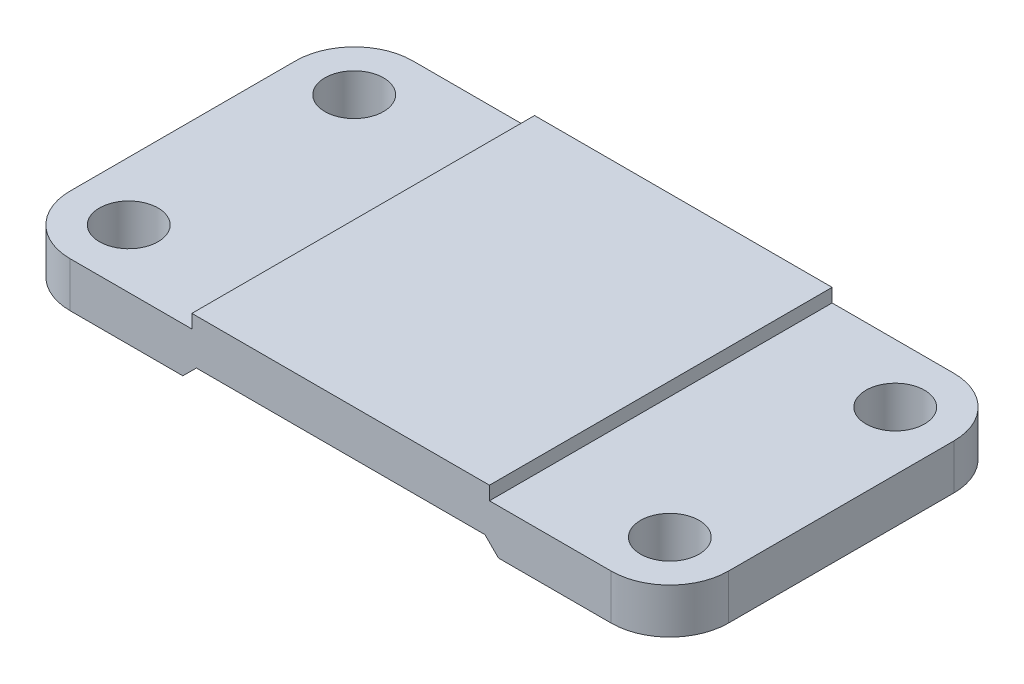
ISO-10303-21;
HEADER;
FILE_DESCRIPTION(('STEP AP214'),'2;1');
FILE_NAME('part.step','',(''),(''),'','','');
FILE_SCHEMA(('AUTOMOTIVE_DESIGN { 1 0 10303 214 1 1 1 1 }'));
ENDSEC;
DATA;
#1=APPLICATION_CONTEXT('core data for automotive mechanical design processes');
#2=APPLICATION_PROTOCOL_DEFINITION('international standard','automotive_design',2000,#1);
#3=PRODUCT_CONTEXT('',#1,'mechanical');
#4=PRODUCT('Part','Part','',(#3));
#5=PRODUCT_RELATED_PRODUCT_CATEGORY('part','',(#4));
#6=PRODUCT_DEFINITION_FORMATION('','',#4);
#7=PRODUCT_DEFINITION_CONTEXT('part definition',#1,'design');
#8=PRODUCT_DEFINITION('design','',#6,#7);
#9=PRODUCT_DEFINITION_SHAPE('','',#8);
#10=(LENGTH_UNIT() NAMED_UNIT(*) SI_UNIT(.MILLI.,.METRE.));
#11=(NAMED_UNIT(*) PLANE_ANGLE_UNIT() SI_UNIT($,.RADIAN.));
#12=(NAMED_UNIT(*) SI_UNIT($,.STERADIAN.) SOLID_ANGLE_UNIT());
#13=UNCERTAINTY_MEASURE_WITH_UNIT(LENGTH_MEASURE(1.E-05),#10,'distance_accuracy_value','');
#14=(GEOMETRIC_REPRESENTATION_CONTEXT(3) GLOBAL_UNCERTAINTY_ASSIGNED_CONTEXT((#13)) GLOBAL_UNIT_ASSIGNED_CONTEXT((#10,
#11,#12)) REPRESENTATION_CONTEXT('',''));
#15=CARTESIAN_POINT('',(0.,0.,0.));
#16=DIRECTION('',(0.,0.,1.));
#17=DIRECTION('',(1.,0.,0.));
#18=AXIS2_PLACEMENT_3D('',#15,#16,#17);
#19=CARTESIAN_POINT('',(0.,0.,0.));
#20=DIRECTION('',(0.,-1.,0.));
#21=DIRECTION('',(0.,0.,-1.));
#22=AXIS2_PLACEMENT_3D('',#19,#20,#21);
#23=PLANE('',#22);
#24=DIRECTION('',(1.,0.,0.));
#25=VECTOR('',#24,1.);
#26=CARTESIAN_POINT('',(-73.,0.,38.));
#27=LINE('',#26,#25);
#28=CARTESIAN_POINT('',(35.,0.,38.));
#29=VERTEX_POINT('',#28);
#30=CARTESIAN_POINT('',(60.,0.,38.));
#31=VERTEX_POINT('',#30);
#32=EDGE_CURVE('E214',#29,#31,#27,.T.);
#33=ORIENTED_EDGE('',*,*,#32,.F.);
#34=DIRECTION('',(0.,0.,1.));
#35=VECTOR('',#34,1.);
#36=CARTESIAN_POINT('',(35.,0.,0.));
#37=LINE('',#36,#35);
#38=CARTESIAN_POINT('',(35.,0.,-38.));
#39=VERTEX_POINT('',#38);
#40=EDGE_CURVE('E62',#29,#39,#37,.F.);
#41=ORIENTED_EDGE('',*,*,#40,.T.);
#42=DIRECTION('',(-1.,0.,0.));
#43=VECTOR('',#42,1.);
#44=CARTESIAN_POINT('',(-73.,0.,-38.));
#45=LINE('',#44,#43);
#46=CARTESIAN_POINT('',(60.,0.,-38.));
#47=VERTEX_POINT('',#46);
#48=EDGE_CURVE('E67',#47,#39,#45,.T.);
#49=ORIENTED_EDGE('',*,*,#48,.F.);
#50=CARTESIAN_POINT('',(60.,0.,-25.));
#51=DIRECTION('',(0.,-1.,0.));
#52=DIRECTION('',(0.,0.,-1.));
#53=AXIS2_PLACEMENT_3D('',#50,#51,#52);
#54=CIRCLE('',#53,13.);
#55=CARTESIAN_POINT('',(73.,0.,-25.));
#56=VERTEX_POINT('',#55);
#57=EDGE_CURVE('E253',#47,#56,#54,.T.);
#58=ORIENTED_EDGE('',*,*,#57,.T.);
#59=DIRECTION('',(0.,0.,-1.));
#60=VECTOR('',#59,1.);
#61=CARTESIAN_POINT('',(73.,0.,38.));
#62=LINE('',#61,#60);
#63=CARTESIAN_POINT('',(73.,0.,25.));
#64=VERTEX_POINT('',#63);
#65=EDGE_CURVE('E188',#64,#56,#62,.T.);
#66=ORIENTED_EDGE('',*,*,#65,.F.);
#67=CARTESIAN_POINT('',(60.,0.,25.));
#68=DIRECTION('',(0.,-1.,0.));
#69=DIRECTION('',(0.,0.,-1.));
#70=AXIS2_PLACEMENT_3D('',#67,#68,#69);
#71=CIRCLE('',#70,13.);
#72=EDGE_CURVE('E241',#64,#31,#71,.T.);
#73=ORIENTED_EDGE('',*,*,#72,.T.);
#74=EDGE_LOOP('',(#33,#41,#49,#58,#66,#73));
#75=FACE_BOUND('',#74,.T.);
#76=CARTESIAN_POINT('',(60.,0.,25.));
#77=DIRECTION('',(0.,1.,0.));
#78=DIRECTION('',(0.,0.,1.));
#79=AXIS2_PLACEMENT_3D('',#76,#77,#78);
#80=CIRCLE('',#79,6.5);
#81=CARTESIAN_POINT('',(60.,0.,31.5));
#82=VERTEX_POINT('',#81);
#83=EDGE_CURVE('E300',#82,#82,#80,.T.);
#84=ORIENTED_EDGE('',*,*,#83,.T.);
#85=EDGE_LOOP('',(#84));
#86=FACE_BOUND('',#85,.T.);
#87=CARTESIAN_POINT('',(60.,0.,-25.));
#88=DIRECTION('',(0.,1.,0.));
#89=DIRECTION('',(0.,0.,1.));
#90=AXIS2_PLACEMENT_3D('',#87,#88,#89);
#91=CIRCLE('',#90,6.5);
#92=CARTESIAN_POINT('',(60.,0.,-18.5));
#93=VERTEX_POINT('',#92);
#94=EDGE_CURVE('E289',#93,#93,#91,.T.);
#95=ORIENTED_EDGE('',*,*,#94,.T.);
#96=EDGE_LOOP('',(#95));
#97=FACE_BOUND('',#96,.T.);
#98=ADVANCED_FACE('F53',(#75,#86,#97),#23,.T.);
#99=CARTESIAN_POINT('',(60.,10.,-25.));
#100=DIRECTION('',(0.,-1.,0.));
#101=DIRECTION('',(0.,0.,-1.));
#102=AXIS2_PLACEMENT_3D('',#99,#100,#101);
#103=CYLINDRICAL_SURFACE('',#102,13.);
#104=DIRECTION('',(0.,-1.,0.));
#105=VECTOR('',#104,1.);
#106=CARTESIAN_POINT('',(60.,10.,-38.));
#107=LINE('',#106,#105);
#108=CARTESIAN_POINT('',(60.,10.,-38.));
#109=VERTEX_POINT('',#108);
#110=EDGE_CURVE('E246',#109,#47,#107,.T.);
#111=ORIENTED_EDGE('',*,*,#110,.F.);
#112=CARTESIAN_POINT('',(60.,10.,-25.));
#113=DIRECTION('',(0.,-1.,0.));
#114=DIRECTION('',(0.,0.,-1.));
#115=AXIS2_PLACEMENT_3D('',#112,#113,#114);
#116=CIRCLE('',#115,13.);
#117=CARTESIAN_POINT('',(73.,10.,-25.));
#118=VERTEX_POINT('',#117);
#119=EDGE_CURVE('E251',#118,#109,#116,.F.);
#120=ORIENTED_EDGE('',*,*,#119,.F.);
#121=DIRECTION('',(0.,-1.,0.));
#122=VECTOR('',#121,1.);
#123=CARTESIAN_POINT('',(73.,10.,-25.));
#124=LINE('',#123,#122);
#125=EDGE_CURVE('E248',#56,#118,#124,.F.);
#126=ORIENTED_EDGE('',*,*,#125,.F.);
#127=ORIENTED_EDGE('',*,*,#57,.F.);
#128=EDGE_LOOP('',(#111,#120,#126,#127));
#129=FACE_BOUND('',#128,.T.);
#130=ADVANCED_FACE('F335',(#129),#103,.T.);
#131=CARTESIAN_POINT('',(60.,10.,25.));
#132=DIRECTION('',(0.,1.,0.));
#133=DIRECTION('',(0.,0.,1.));
#134=AXIS2_PLACEMENT_3D('',#131,#132,#133);
#135=CYLINDRICAL_SURFACE('',#134,13.);
#136=DIRECTION('',(0.,1.,0.));
#137=VECTOR('',#136,1.);
#138=CARTESIAN_POINT('',(60.,10.,38.));
#139=LINE('',#138,#137);
#140=CARTESIAN_POINT('',(60.,10.,38.));
#141=VERTEX_POINT('',#140);
#142=EDGE_CURVE('E235',#31,#141,#139,.T.);
#143=ORIENTED_EDGE('',*,*,#142,.F.);
#144=ORIENTED_EDGE('',*,*,#72,.F.);
#145=DIRECTION('',(0.,1.,0.));
#146=VECTOR('',#145,1.);
#147=CARTESIAN_POINT('',(73.,10.,25.));
#148=LINE('',#147,#146);
#149=CARTESIAN_POINT('',(73.,10.,25.));
#150=VERTEX_POINT('',#149);
#151=EDGE_CURVE('E238',#150,#64,#148,.F.);
#152=ORIENTED_EDGE('',*,*,#151,.F.);
#153=CARTESIAN_POINT('',(60.,10.,25.));
#154=DIRECTION('',(0.,-1.,0.));
#155=DIRECTION('',(0.,0.,-1.));
#156=AXIS2_PLACEMENT_3D('',#153,#154,#155);
#157=CIRCLE('',#156,13.);
#158=EDGE_CURVE('E244',#141,#150,#157,.F.);
#159=ORIENTED_EDGE('',*,*,#158,.F.);
#160=EDGE_LOOP('',(#143,#144,#152,#159));
#161=FACE_BOUND('',#160,.T.);
#162=ADVANCED_FACE('F342',(#161),#135,.T.);
#163=CARTESIAN_POINT('',(-60.,10.,25.));
#164=DIRECTION('',(0.,1.,0.));
#165=DIRECTION('',(0.,0.,1.));
#166=AXIS2_PLACEMENT_3D('',#163,#164,#165);
#167=CYLINDRICAL_SURFACE('',#166,13.);
#168=DIRECTION('',(0.,1.,0.));
#169=VECTOR('',#168,1.);
#170=CARTESIAN_POINT('',(-73.,10.,25.));
#171=LINE('',#170,#169);
#172=CARTESIAN_POINT('',(-73.,0.,25.));
#173=VERTEX_POINT('',#172);
#174=CARTESIAN_POINT('',(-73.,10.,25.));
#175=VERTEX_POINT('',#174);
#176=EDGE_CURVE('E225',#173,#175,#171,.T.);
#177=ORIENTED_EDGE('',*,*,#176,.F.);
#178=CARTESIAN_POINT('',(-60.,0.,25.));
#179=DIRECTION('',(0.,-1.,0.));
#180=DIRECTION('',(0.,0.,-1.));
#181=AXIS2_PLACEMENT_3D('',#178,#179,#180);
#182=CIRCLE('',#181,13.);
#183=CARTESIAN_POINT('',(-60.,0.,38.));
#184=VERTEX_POINT('',#183);
#185=EDGE_CURVE('E231',#184,#173,#182,.T.);
#186=ORIENTED_EDGE('',*,*,#185,.F.);
#187=DIRECTION('',(0.,1.,0.));
#188=VECTOR('',#187,1.);
#189=CARTESIAN_POINT('',(-60.,10.,38.));
#190=LINE('',#189,#188);
#191=CARTESIAN_POINT('',(-60.,10.,38.));
#192=VERTEX_POINT('',#191);
#193=EDGE_CURVE('E228',#192,#184,#190,.F.);
#194=ORIENTED_EDGE('',*,*,#193,.F.);
#195=CARTESIAN_POINT('',(-60.,10.,25.));
#196=DIRECTION('',(0.,-1.,0.));
#197=DIRECTION('',(0.,0.,-1.));
#198=AXIS2_PLACEMENT_3D('',#195,#196,#197);
#199=CIRCLE('',#198,13.);
#200=EDGE_CURVE('E233',#175,#192,#199,.F.);
#201=ORIENTED_EDGE('',*,*,#200,.F.);
#202=EDGE_LOOP('',(#177,#186,#194,#201));
#203=FACE_BOUND('',#202,.T.);
#204=ADVANCED_FACE('F344',(#203),#167,.T.);
#205=CARTESIAN_POINT('',(-60.,10.,-25.));
#206=DIRECTION('',(0.,1.,0.));
#207=DIRECTION('',(0.,0.,1.));
#208=AXIS2_PLACEMENT_3D('',#205,#206,#207);
#209=CYLINDRICAL_SURFACE('',#208,13.);
#210=DIRECTION('',(0.,1.,0.));
#211=VECTOR('',#210,1.);
#212=CARTESIAN_POINT('',(-60.,10.,-38.));
#213=LINE('',#212,#211);
#214=CARTESIAN_POINT('',(-60.,0.,-38.));
#215=VERTEX_POINT('',#214);
#216=CARTESIAN_POINT('',(-60.,10.,-38.));
#217=VERTEX_POINT('',#216);
#218=EDGE_CURVE('E208',#215,#217,#213,.T.);
#219=ORIENTED_EDGE('',*,*,#218,.F.);
#220=CARTESIAN_POINT('',(-60.,0.,-25.));
#221=DIRECTION('',(0.,-1.,0.));
#222=DIRECTION('',(0.,0.,-1.));
#223=AXIS2_PLACEMENT_3D('',#220,#221,#222);
#224=CIRCLE('',#223,13.);
#225=CARTESIAN_POINT('',(-73.,0.,-25.));
#226=VERTEX_POINT('',#225);
#227=EDGE_CURVE('E220',#226,#215,#224,.T.);
#228=ORIENTED_EDGE('',*,*,#227,.F.);
#229=DIRECTION('',(0.,1.,0.));
#230=VECTOR('',#229,1.);
#231=CARTESIAN_POINT('',(-73.,10.,-25.));
#232=LINE('',#231,#230);
#233=CARTESIAN_POINT('',(-73.,10.,-25.));
#234=VERTEX_POINT('',#233);
#235=EDGE_CURVE('E217',#234,#226,#232,.F.);
#236=ORIENTED_EDGE('',*,*,#235,.F.);
#237=CARTESIAN_POINT('',(-60.,10.,-25.));
#238=DIRECTION('',(0.,-1.,0.));
#239=DIRECTION('',(0.,0.,-1.));
#240=AXIS2_PLACEMENT_3D('',#237,#238,#239);
#241=CIRCLE('',#240,13.);
#242=EDGE_CURVE('E223',#217,#234,#241,.F.);
#243=ORIENTED_EDGE('',*,*,#242,.F.);
#244=EDGE_LOOP('',(#219,#228,#236,#243));
#245=FACE_BOUND('',#244,.T.);
#246=ADVANCED_FACE('F350',(#245),#209,.T.);
#247=CARTESIAN_POINT('',(0.,10.,0.));
#248=DIRECTION('',(0.,-1.,0.));
#249=DIRECTION('',(0.,0.,-1.));
#250=AXIS2_PLACEMENT_3D('',#247,#248,#249);
#251=PLANE('',#250);
#252=CARTESIAN_POINT('',(60.,10.,-25.));
#253=DIRECTION('',(0.,1.,0.));
#254=DIRECTION('',(0.,0.,1.));
#255=AXIS2_PLACEMENT_3D('',#252,#253,#254);
#256=CIRCLE('',#255,6.5);
#257=CARTESIAN_POINT('',(60.,10.,-18.5));
#258=VERTEX_POINT('',#257);
#259=EDGE_CURVE('E285',#258,#258,#256,.T.);
#260=ORIENTED_EDGE('',*,*,#259,.F.);
#261=EDGE_LOOP('',(#260));
#262=FACE_BOUND('',#261,.T.);
#263=CARTESIAN_POINT('',(60.,10.,25.));
#264=DIRECTION('',(0.,1.,0.));
#265=DIRECTION('',(0.,0.,1.));
#266=AXIS2_PLACEMENT_3D('',#263,#264,#265);
#267=CIRCLE('',#266,6.5);
#268=CARTESIAN_POINT('',(60.,10.,31.5));
#269=VERTEX_POINT('',#268);
#270=EDGE_CURVE('E303',#269,#269,#267,.T.);
#271=ORIENTED_EDGE('',*,*,#270,.F.);
#272=EDGE_LOOP('',(#271));
#273=FACE_BOUND('',#272,.T.);
#274=DIRECTION('',(0.,0.,-1.));
#275=VECTOR('',#274,1.);
#276=CARTESIAN_POINT('',(73.,10.,38.));
#277=LINE('',#276,#275);
#278=EDGE_CURVE('E197',#150,#118,#277,.T.);
#279=ORIENTED_EDGE('',*,*,#278,.T.);
#280=ORIENTED_EDGE('',*,*,#119,.T.);
#281=DIRECTION('',(-1.,0.,0.));
#282=VECTOR('',#281,1.);
#283=CARTESIAN_POINT('',(-73.,10.,-38.));
#284=LINE('',#283,#282);
#285=CARTESIAN_POINT('',(33.,10.,-38.));
#286=VERTEX_POINT('',#285);
#287=EDGE_CURVE('E201',#109,#286,#284,.T.);
#288=ORIENTED_EDGE('',*,*,#287,.T.);
#289=DIRECTION('',(0.,0.,-1.));
#290=VECTOR('',#289,1.);
#291=CARTESIAN_POINT('',(33.,10.,-38.));
#292=LINE('',#291,#290);
#293=CARTESIAN_POINT('',(33.,10.,38.));
#294=VERTEX_POINT('',#293);
#295=EDGE_CURVE('E181',#294,#286,#292,.T.);
#296=ORIENTED_EDGE('',*,*,#295,.F.);
#297=DIRECTION('',(1.,0.,0.));
#298=VECTOR('',#297,1.);
#299=CARTESIAN_POINT('',(-73.,10.,38.));
#300=LINE('',#299,#298);
#301=EDGE_CURVE('E206',#294,#141,#300,.T.);
#302=ORIENTED_EDGE('',*,*,#301,.T.);
#303=ORIENTED_EDGE('',*,*,#158,.T.);
#304=EDGE_LOOP('',(#279,#280,#288,#296,#302,#303));
#305=FACE_BOUND('',#304,.T.);
#306=ADVANCED_FACE('F330',(#262,#273,#305),#251,.F.);
#307=CARTESIAN_POINT('',(-60.,10.,25.));
#308=DIRECTION('',(0.,1.,0.));
#309=DIRECTION('',(0.,0.,1.));
#310=AXIS2_PLACEMENT_3D('',#307,#308,#309);
#311=CIRCLE('',#310,6.5);
#312=CARTESIAN_POINT('',(-60.,10.,31.5));
#313=VERTEX_POINT('',#312);
#314=EDGE_CURVE('E297',#313,#313,#311,.T.);
#315=ORIENTED_EDGE('',*,*,#314,.F.);
#316=EDGE_LOOP('',(#315));
#317=FACE_BOUND('',#316,.T.);
#318=CARTESIAN_POINT('',(-60.,10.,-25.));
#319=DIRECTION('',(0.,1.,0.));
#320=DIRECTION('',(0.,0.,1.));
#321=AXIS2_PLACEMENT_3D('',#318,#319,#320);
#322=CIRCLE('',#321,6.5);
#323=CARTESIAN_POINT('',(-60.,10.,-18.5));
#324=VERTEX_POINT('',#323);
#325=EDGE_CURVE('E296',#324,#324,#322,.T.);
#326=ORIENTED_EDGE('',*,*,#325,.F.);
#327=EDGE_LOOP('',(#326));
#328=FACE_BOUND('',#327,.T.);
#329=DIRECTION('',(0.,0.,1.));
#330=VECTOR('',#329,1.);
#331=CARTESIAN_POINT('',(-73.,10.,38.));
#332=LINE('',#331,#330);
#333=EDGE_CURVE('E203',#234,#175,#332,.T.);
#334=ORIENTED_EDGE('',*,*,#333,.T.);
#335=ORIENTED_EDGE('',*,*,#200,.T.);
#336=CARTESIAN_POINT('',(-33.,10.,38.));
#337=VERTEX_POINT('',#336);
#338=EDGE_CURVE('E207',#192,#337,#300,.T.);
#339=ORIENTED_EDGE('',*,*,#338,.T.);
#340=DIRECTION('',(0.,0.,1.));
#341=VECTOR('',#340,1.);
#342=CARTESIAN_POINT('',(-33.,10.,-38.));
#343=LINE('',#342,#341);
#344=CARTESIAN_POINT('',(-33.,10.,-38.));
#345=VERTEX_POINT('',#344);
#346=EDGE_CURVE('E311',#345,#337,#343,.T.);
#347=ORIENTED_EDGE('',*,*,#346,.F.);
#348=EDGE_CURVE('E187',#345,#217,#284,.T.);
#349=ORIENTED_EDGE('',*,*,#348,.T.);
#350=ORIENTED_EDGE('',*,*,#242,.T.);
#351=EDGE_LOOP('',(#334,#335,#339,#347,#349,#350));
#352=FACE_BOUND('',#351,.T.);
#353=ADVANCED_FACE('F381',(#317,#328,#352),#251,.F.);
#354=CARTESIAN_POINT('',(73.,10.,38.));
#355=DIRECTION('',(-1.,0.,0.));
#356=DIRECTION('',(0.,0.,1.));
#357=AXIS2_PLACEMENT_3D('',#354,#355,#356);
#358=PLANE('',#357);
#359=ORIENTED_EDGE('',*,*,#65,.T.);
#360=ORIENTED_EDGE('',*,*,#125,.T.);
#361=ORIENTED_EDGE('',*,*,#278,.F.);
#362=ORIENTED_EDGE('',*,*,#151,.T.);
#363=EDGE_LOOP('',(#359,#360,#361,#362));
#364=FACE_BOUND('',#363,.T.);
#365=ADVANCED_FACE('F339',(#364),#358,.F.);
#366=CARTESIAN_POINT('',(-73.,10.,-38.));
#367=DIRECTION('',(0.,0.,1.));
#368=DIRECTION('',(1.,0.,0.));
#369=AXIS2_PLACEMENT_3D('',#366,#367,#368);
#370=PLANE('',#369);
#371=ORIENTED_EDGE('',*,*,#48,.T.);
#372=DIRECTION('',(0.707106781186551,-0.707106781186544,0.));
#373=VECTOR('',#372,1.);
#374=CARTESIAN_POINT('',(-24.0000000000006,58.9999999999999,-38.));
#375=LINE('',#374,#373);
#376=CARTESIAN_POINT('',(31.9999999999999,3.,-38.));
#377=VERTEX_POINT('',#376);
#378=EDGE_CURVE('E13',#39,#377,#375,.F.);
#379=ORIENTED_EDGE('',*,*,#378,.T.);
#380=DIRECTION('',(1.,0.,0.));
#381=VECTOR('',#380,1.);
#382=CARTESIAN_POINT('',(-36.,3.,-38.));
#383=LINE('',#382,#381);
#384=CARTESIAN_POINT('',(-31.9999999999999,3.,-38.));
#385=VERTEX_POINT('',#384);
#386=EDGE_CURVE('E280',#385,#377,#383,.T.);
#387=ORIENTED_EDGE('',*,*,#386,.F.);
#388=DIRECTION('',(0.707106781186551,0.707106781186544,0.));
#389=VECTOR('',#388,1.);
#390=CARTESIAN_POINT('',(-49.0000000000002,-14.0000000000001,-38.));
#391=LINE('',#390,#389);
#392=CARTESIAN_POINT('',(-34.9999999999999,0.,-38.));
#393=VERTEX_POINT('',#392);
#394=EDGE_CURVE('E258',#385,#393,#391,.F.);
#395=ORIENTED_EDGE('',*,*,#394,.T.);
#396=EDGE_CURVE('E191',#393,#215,#45,.T.);
#397=ORIENTED_EDGE('',*,*,#396,.T.);
#398=ORIENTED_EDGE('',*,*,#218,.T.);
#399=ORIENTED_EDGE('',*,*,#348,.F.);
#400=DIRECTION('',(0.,-1.,0.));
#401=VECTOR('',#400,1.);
#402=CARTESIAN_POINT('',(-33.,13.,-38.));
#403=LINE('',#402,#401);
#404=CARTESIAN_POINT('',(-33.,13.,-38.));
#405=VERTEX_POINT('',#404);
#406=EDGE_CURVE('E167',#405,#345,#403,.T.);
#407=ORIENTED_EDGE('',*,*,#406,.F.);
#408=DIRECTION('',(-1.,0.,0.));
#409=VECTOR('',#408,1.);
#410=CARTESIAN_POINT('',(-33.,13.,-38.));
#411=LINE('',#410,#409);
#412=CARTESIAN_POINT('',(33.,13.,-38.));
#413=VERTEX_POINT('',#412);
#414=EDGE_CURVE('E173',#413,#405,#411,.T.);
#415=ORIENTED_EDGE('',*,*,#414,.F.);
#416=DIRECTION('',(0.,-1.,0.));
#417=VECTOR('',#416,1.);
#418=CARTESIAN_POINT('',(33.,13.,-38.));
#419=LINE('',#418,#417);
#420=EDGE_CURVE('E316',#413,#286,#419,.T.);
#421=ORIENTED_EDGE('',*,*,#420,.T.);
#422=ORIENTED_EDGE('',*,*,#287,.F.);
#423=ORIENTED_EDGE('',*,*,#110,.T.);
#424=EDGE_LOOP('',(#371,#379,#387,#395,#397,#398,#399,#407,#415,#421,#422,#423));
#425=FACE_BOUND('',#424,.T.);
#426=ADVANCED_FACE('F184',(#425),#370,.F.);
#427=CARTESIAN_POINT('',(-73.,10.,38.));
#428=DIRECTION('',(1.,0.,0.));
#429=DIRECTION('',(0.,0.,-1.));
#430=AXIS2_PLACEMENT_3D('',#427,#428,#429);
#431=PLANE('',#430);
#432=DIRECTION('',(0.,0.,1.));
#433=VECTOR('',#432,1.);
#434=CARTESIAN_POINT('',(-73.,0.,38.));
#435=LINE('',#434,#433);
#436=EDGE_CURVE('E211',#226,#173,#435,.T.);
#437=ORIENTED_EDGE('',*,*,#436,.T.);
#438=ORIENTED_EDGE('',*,*,#176,.T.);
#439=ORIENTED_EDGE('',*,*,#333,.F.);
#440=ORIENTED_EDGE('',*,*,#235,.T.);
#441=EDGE_LOOP('',(#437,#438,#439,#440));
#442=FACE_BOUND('',#441,.T.);
#443=ADVANCED_FACE('F368',(#442),#431,.F.);
#444=CARTESIAN_POINT('',(-73.,10.,38.));
#445=DIRECTION('',(0.,0.,-1.));
#446=DIRECTION('',(-1.,0.,0.));
#447=AXIS2_PLACEMENT_3D('',#444,#445,#446);
#448=PLANE('',#447);
#449=DIRECTION('',(-1.,0.,0.));
#450=VECTOR('',#449,1.);
#451=CARTESIAN_POINT('',(-36.,3.,38.));
#452=LINE('',#451,#450);
#453=CARTESIAN_POINT('',(31.9999999999999,3.,38.));
#454=VERTEX_POINT('',#453);
#455=CARTESIAN_POINT('',(-31.9999999999999,3.,38.));
#456=VERTEX_POINT('',#455);
#457=EDGE_CURVE('E286',#454,#456,#452,.T.);
#458=ORIENTED_EDGE('',*,*,#457,.F.);
#459=DIRECTION('',(-0.707106781186551,0.707106781186544,0.));
#460=VECTOR('',#459,1.);
#461=CARTESIAN_POINT('',(-24.0000000000006,58.9999999999999,38.));
#462=LINE('',#461,#460);
#463=EDGE_CURVE('E270',#454,#29,#462,.F.);
#464=ORIENTED_EDGE('',*,*,#463,.T.);
#465=ORIENTED_EDGE('',*,*,#32,.T.);
#466=ORIENTED_EDGE('',*,*,#142,.T.);
#467=ORIENTED_EDGE('',*,*,#301,.F.);
#468=DIRECTION('',(0.,-1.,0.));
#469=VECTOR('',#468,1.);
#470=CARTESIAN_POINT('',(33.,13.,38.));
#471=LINE('',#470,#469);
#472=CARTESIAN_POINT('',(33.,13.,38.));
#473=VERTEX_POINT('',#472);
#474=EDGE_CURVE('E193',#473,#294,#471,.T.);
#475=ORIENTED_EDGE('',*,*,#474,.F.);
#476=DIRECTION('',(1.,0.,0.));
#477=VECTOR('',#476,1.);
#478=CARTESIAN_POINT('',(-33.,13.,38.));
#479=LINE('',#478,#477);
#480=CARTESIAN_POINT('',(-33.,13.,38.));
#481=VERTEX_POINT('',#480);
#482=EDGE_CURVE('E172',#481,#473,#479,.T.);
#483=ORIENTED_EDGE('',*,*,#482,.F.);
#484=DIRECTION('',(0.,-1.,0.));
#485=VECTOR('',#484,1.);
#486=CARTESIAN_POINT('',(-33.,13.,38.));
#487=LINE('',#486,#485);
#488=EDGE_CURVE('E169',#481,#337,#487,.T.);
#489=ORIENTED_EDGE('',*,*,#488,.T.);
#490=ORIENTED_EDGE('',*,*,#338,.F.);
#491=ORIENTED_EDGE('',*,*,#193,.T.);
#492=CARTESIAN_POINT('',(-35.,0.,38.));
#493=VERTEX_POINT('',#492);
#494=EDGE_CURVE('E200',#184,#493,#27,.T.);
#495=ORIENTED_EDGE('',*,*,#494,.T.);
#496=DIRECTION('',(-0.707106781186551,-0.707106781186544,0.));
#497=VECTOR('',#496,1.);
#498=CARTESIAN_POINT('',(-49.0000000000002,-14.0000000000001,38.));
#499=LINE('',#498,#497);
#500=EDGE_CURVE('E264',#493,#456,#499,.F.);
#501=ORIENTED_EDGE('',*,*,#500,.T.);
#502=EDGE_LOOP('',(#458,#464,#465,#466,#467,#475,#483,#489,#490,#491,#495,#501));
#503=FACE_BOUND('',#502,.T.);
#504=ADVANCED_FACE('F326',(#503),#448,.F.);
#505=ORIENTED_EDGE('',*,*,#396,.F.);
#506=DIRECTION('',(0.,0.,-1.));
#507=VECTOR('',#506,1.);
#508=CARTESIAN_POINT('',(-35.,0.,0.));
#509=LINE('',#508,#507);
#510=EDGE_CURVE('E261',#393,#493,#509,.F.);
#511=ORIENTED_EDGE('',*,*,#510,.T.);
#512=ORIENTED_EDGE('',*,*,#494,.F.);
#513=ORIENTED_EDGE('',*,*,#185,.T.);
#514=ORIENTED_EDGE('',*,*,#436,.F.);
#515=ORIENTED_EDGE('',*,*,#227,.T.);
#516=EDGE_LOOP('',(#505,#511,#512,#513,#514,#515));
#517=FACE_BOUND('',#516,.T.);
#518=CARTESIAN_POINT('',(-60.,0.,25.));
#519=DIRECTION('',(0.,1.,0.));
#520=DIRECTION('',(0.,0.,1.));
#521=AXIS2_PLACEMENT_3D('',#518,#519,#520);
#522=CIRCLE('',#521,6.5);
#523=CARTESIAN_POINT('',(-60.,0.,31.5));
#524=VERTEX_POINT('',#523);
#525=EDGE_CURVE('E293',#524,#524,#522,.T.);
#526=ORIENTED_EDGE('',*,*,#525,.T.);
#527=EDGE_LOOP('',(#526));
#528=FACE_BOUND('',#527,.T.);
#529=CARTESIAN_POINT('',(-60.,0.,-25.));
#530=DIRECTION('',(0.,1.,0.));
#531=DIRECTION('',(0.,0.,1.));
#532=AXIS2_PLACEMENT_3D('',#529,#530,#531);
#533=CIRCLE('',#532,6.5);
#534=CARTESIAN_POINT('',(-60.,0.,-18.5));
#535=VERTEX_POINT('',#534);
#536=EDGE_CURVE('E308',#535,#535,#533,.T.);
#537=ORIENTED_EDGE('',*,*,#536,.T.);
#538=EDGE_LOOP('',(#537));
#539=FACE_BOUND('',#538,.T.);
#540=ADVANCED_FACE('F356',(#517,#528,#539),#23,.T.);
#541=CARTESIAN_POINT('',(-33.,13.,-38.));
#542=DIRECTION('',(1.,0.,0.));
#543=DIRECTION('',(0.,0.,-1.));
#544=AXIS2_PLACEMENT_3D('',#541,#542,#543);
#545=PLANE('',#544);
#546=ORIENTED_EDGE('',*,*,#346,.T.);
#547=ORIENTED_EDGE('',*,*,#488,.F.);
#548=DIRECTION('',(0.,0.,1.));
#549=VECTOR('',#548,1.);
#550=CARTESIAN_POINT('',(-33.,13.,-38.));
#551=LINE('',#550,#549);
#552=EDGE_CURVE('E162',#405,#481,#551,.T.);
#553=ORIENTED_EDGE('',*,*,#552,.F.);
#554=ORIENTED_EDGE('',*,*,#406,.T.);
#555=EDGE_LOOP('',(#546,#547,#553,#554));
#556=FACE_BOUND('',#555,.T.);
#557=ADVANCED_FACE('F165',(#556),#545,.F.);
#558=CARTESIAN_POINT('',(33.,13.,-38.));
#559=DIRECTION('',(-1.,0.,0.));
#560=DIRECTION('',(0.,0.,1.));
#561=AXIS2_PLACEMENT_3D('',#558,#559,#560);
#562=PLANE('',#561);
#563=ORIENTED_EDGE('',*,*,#295,.T.);
#564=ORIENTED_EDGE('',*,*,#420,.F.);
#565=DIRECTION('',(0.,0.,-1.));
#566=VECTOR('',#565,1.);
#567=CARTESIAN_POINT('',(33.,13.,-38.));
#568=LINE('',#567,#566);
#569=EDGE_CURVE('E178',#473,#413,#568,.T.);
#570=ORIENTED_EDGE('',*,*,#569,.F.);
#571=ORIENTED_EDGE('',*,*,#474,.T.);
#572=EDGE_LOOP('',(#563,#564,#570,#571));
#573=FACE_BOUND('',#572,.T.);
#574=ADVANCED_FACE('F323',(#573),#562,.F.);
#575=CARTESIAN_POINT('',(0.,13.,0.));
#576=DIRECTION('',(0.,-1.,0.));
#577=DIRECTION('',(0.,0.,-1.));
#578=AXIS2_PLACEMENT_3D('',#575,#576,#577);
#579=PLANE('',#578);
#580=ORIENTED_EDGE('',*,*,#414,.T.);
#581=ORIENTED_EDGE('',*,*,#552,.T.);
#582=ORIENTED_EDGE('',*,*,#482,.T.);
#583=ORIENTED_EDGE('',*,*,#569,.T.);
#584=EDGE_LOOP('',(#580,#581,#582,#583));
#585=FACE_BOUND('',#584,.T.);
#586=ADVANCED_FACE('F176',(#585),#579,.F.);
#587=CARTESIAN_POINT('',(-60.,0.,-25.));
#588=DIRECTION('',(0.,1.,0.));
#589=DIRECTION('',(0.,0.,1.));
#590=AXIS2_PLACEMENT_3D('',#587,#588,#589);
#591=CYLINDRICAL_SURFACE('',#590,6.5);
#592=ORIENTED_EDGE('',*,*,#536,.F.);
#593=EDGE_LOOP('',(#592));
#594=FACE_BOUND('',#593,.T.);
#595=ORIENTED_EDGE('',*,*,#325,.T.);
#596=EDGE_LOOP('',(#595));
#597=FACE_BOUND('',#596,.T.);
#598=ADVANCED_FACE('F374',(#594,#597),#591,.F.);
#599=CARTESIAN_POINT('',(-60.,0.,25.));
#600=DIRECTION('',(0.,1.,0.));
#601=DIRECTION('',(0.,0.,1.));
#602=AXIS2_PLACEMENT_3D('',#599,#600,#601);
#603=CYLINDRICAL_SURFACE('',#602,6.5);
#604=ORIENTED_EDGE('',*,*,#525,.F.);
#605=EDGE_LOOP('',(#604));
#606=FACE_BOUND('',#605,.T.);
#607=ORIENTED_EDGE('',*,*,#314,.T.);
#608=EDGE_LOOP('',(#607));
#609=FACE_BOUND('',#608,.T.);
#610=ADVANCED_FACE('F377',(#606,#609),#603,.F.);
#611=CARTESIAN_POINT('',(60.,0.,25.));
#612=DIRECTION('',(0.,1.,0.));
#613=DIRECTION('',(0.,0.,1.));
#614=AXIS2_PLACEMENT_3D('',#611,#612,#613);
#615=CYLINDRICAL_SURFACE('',#614,6.5);
#616=ORIENTED_EDGE('',*,*,#83,.F.);
#617=EDGE_LOOP('',(#616));
#618=FACE_BOUND('',#617,.T.);
#619=ORIENTED_EDGE('',*,*,#270,.T.);
#620=EDGE_LOOP('',(#619));
#621=FACE_BOUND('',#620,.T.);
#622=ADVANCED_FACE('F463',(#618,#621),#615,.F.);
#623=CARTESIAN_POINT('',(60.,0.,-25.));
#624=DIRECTION('',(0.,1.,0.));
#625=DIRECTION('',(0.,0.,1.));
#626=AXIS2_PLACEMENT_3D('',#623,#624,#625);
#627=CYLINDRICAL_SURFACE('',#626,6.5);
#628=ORIENTED_EDGE('',*,*,#94,.F.);
#629=EDGE_LOOP('',(#628));
#630=FACE_BOUND('',#629,.T.);
#631=ORIENTED_EDGE('',*,*,#259,.T.);
#632=EDGE_LOOP('',(#631));
#633=FACE_BOUND('',#632,.T.);
#634=ADVANCED_FACE('F433',(#630,#633),#627,.F.);
#635=CARTESIAN_POINT('',(0.,3.,0.));
#636=DIRECTION('',(0.,1.,0.));
#637=DIRECTION('',(0.,0.,1.));
#638=AXIS2_PLACEMENT_3D('',#635,#636,#637);
#639=PLANE('',#638);
#640=ORIENTED_EDGE('',*,*,#386,.T.);
#641=DIRECTION('',(0.,0.,1.));
#642=VECTOR('',#641,1.);
#643=CARTESIAN_POINT('',(31.9999999999999,3.,38.));
#644=LINE('',#643,#642);
#645=EDGE_CURVE('E267',#377,#454,#644,.T.);
#646=ORIENTED_EDGE('',*,*,#645,.T.);
#647=ORIENTED_EDGE('',*,*,#457,.T.);
#648=DIRECTION('',(0.,0.,-1.));
#649=VECTOR('',#648,1.);
#650=CARTESIAN_POINT('',(-31.9999999999999,3.,-38.));
#651=LINE('',#650,#649);
#652=EDGE_CURVE('E255',#456,#385,#651,.T.);
#653=ORIENTED_EDGE('',*,*,#652,.T.);
#654=EDGE_LOOP('',(#640,#646,#647,#653));
#655=FACE_BOUND('',#654,.T.);
#656=ADVANCED_FACE('F282',(#655),#639,.F.);
#657=CARTESIAN_POINT('',(-31.9999999999999,3.,0.));
#658=DIRECTION('',(0.707106781186544,-0.707106781186551,0.));
#659=DIRECTION('',(0.,0.,1.));
#660=AXIS2_PLACEMENT_3D('',#657,#658,#659);
#661=PLANE('',#660);
#662=ORIENTED_EDGE('',*,*,#500,.F.);
#663=ORIENTED_EDGE('',*,*,#510,.F.);
#664=ORIENTED_EDGE('',*,*,#394,.F.);
#665=ORIENTED_EDGE('',*,*,#652,.F.);
#666=EDGE_LOOP('',(#662,#663,#664,#665));
#667=FACE_BOUND('',#666,.T.);
#668=ADVANCED_FACE('F396',(#667),#661,.T.);
#669=CARTESIAN_POINT('',(31.9999999999999,3.,0.));
#670=DIRECTION('',(-0.707106781186544,-0.707106781186551,0.));
#671=DIRECTION('',(0.,0.,-1.));
#672=AXIS2_PLACEMENT_3D('',#669,#670,#671);
#673=PLANE('',#672);
#674=ORIENTED_EDGE('',*,*,#378,.F.);
#675=ORIENTED_EDGE('',*,*,#40,.F.);
#676=ORIENTED_EDGE('',*,*,#463,.F.);
#677=ORIENTED_EDGE('',*,*,#645,.F.);
#678=EDGE_LOOP('',(#674,#675,#676,#677));
#679=FACE_BOUND('',#678,.T.);
#680=ADVANCED_FACE('F55',(#679),#673,.T.);
#681=CLOSED_SHELL('',(#98,#130,#162,#204,#246,#306,#353,#365,#426,#443,#504,#540,#557,#574,#586,
#598,#610,#622,#634,#656,#668,#680));
#682=MANIFOLD_SOLID_BREP('B2',#681);
#683=ADVANCED_BREP_SHAPE_REPRESENTATION('',(#18,#682),#14);
#684=SHAPE_DEFINITION_REPRESENTATION(#9,#683);
ENDSEC;
END-ISO-10303-21;
